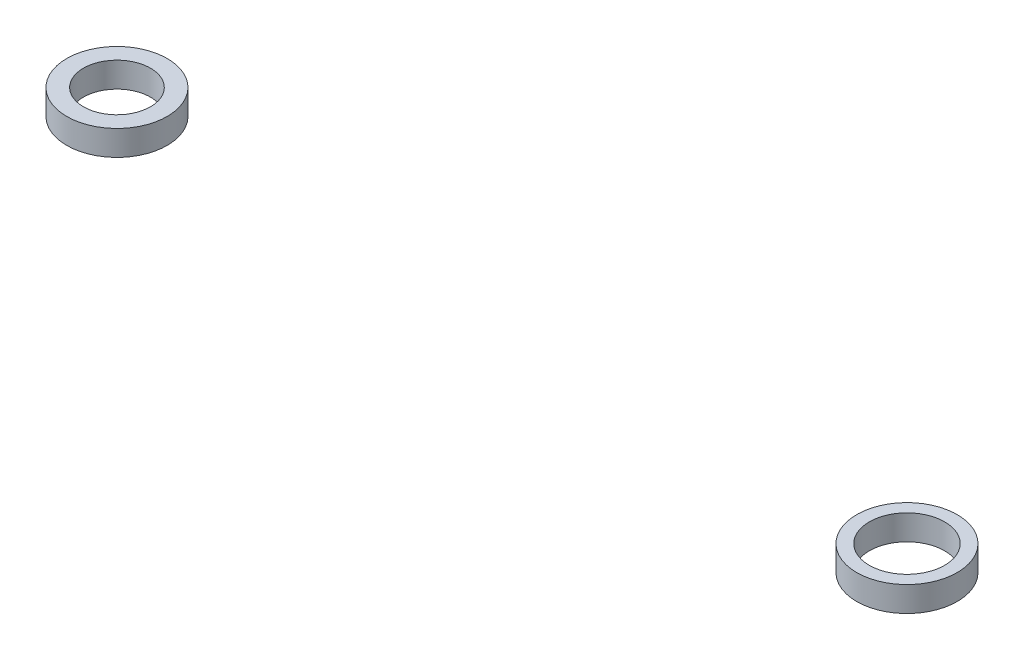
ISO-10303-21;
HEADER;
FILE_DESCRIPTION(('STEP AP214'),'2;1');
FILE_NAME('part.step','',(''),(''),'','','');
FILE_SCHEMA(('AUTOMOTIVE_DESIGN { 1 0 10303 214 1 1 1 1 }'));
ENDSEC;
DATA;
#1=APPLICATION_CONTEXT('core data for automotive mechanical design processes');
#2=APPLICATION_PROTOCOL_DEFINITION('international standard','automotive_design',2000,#1);
#3=PRODUCT_CONTEXT('',#1,'mechanical');
#4=PRODUCT('Part','Part','',(#3));
#5=PRODUCT_RELATED_PRODUCT_CATEGORY('part','',(#4));
#6=PRODUCT_DEFINITION_FORMATION('','',#4);
#7=PRODUCT_DEFINITION_CONTEXT('part definition',#1,'design');
#8=PRODUCT_DEFINITION('design','',#6,#7);
#9=PRODUCT_DEFINITION_SHAPE('','',#8);
#10=(LENGTH_UNIT() NAMED_UNIT(*) SI_UNIT(.MILLI.,.METRE.));
#11=(NAMED_UNIT(*) PLANE_ANGLE_UNIT() SI_UNIT($,.RADIAN.));
#12=(NAMED_UNIT(*) SI_UNIT($,.STERADIAN.) SOLID_ANGLE_UNIT());
#13=UNCERTAINTY_MEASURE_WITH_UNIT(LENGTH_MEASURE(1.E-05),#10,'distance_accuracy_value','');
#14=(GEOMETRIC_REPRESENTATION_CONTEXT(3) GLOBAL_UNCERTAINTY_ASSIGNED_CONTEXT((#13)) GLOBAL_UNIT_ASSIGNED_CONTEXT((#10,
#11,#12)) REPRESENTATION_CONTEXT('',''));
#15=CARTESIAN_POINT('',(0.,0.,0.));
#16=DIRECTION('',(0.,0.,1.));
#17=DIRECTION('',(1.,0.,0.));
#18=AXIS2_PLACEMENT_3D('',#15,#16,#17);
#19=CARTESIAN_POINT('',(94.3699605686569,3.,0.));
#20=DIRECTION('',(0.,1.,0.));
#21=DIRECTION('',(0.,0.,1.));
#22=AXIS2_PLACEMENT_3D('',#19,#20,#21);
#23=PLANE('',#22);
#24=CARTESIAN_POINT('',(94.3699605686569,3.,0.));
#25=DIRECTION('',(0.,1.,0.));
#26=DIRECTION('',(0.,0.,1.));
#27=AXIS2_PLACEMENT_3D('',#24,#25,#26);
#28=CIRCLE('',#27,6.);
#29=CARTESIAN_POINT('',(94.3699605686569,3.,6.));
#30=VERTEX_POINT('',#29);
#31=EDGE_CURVE('E64',#30,#30,#28,.T.);
#32=ORIENTED_EDGE('',*,*,#31,.T.);
#33=EDGE_LOOP('',(#32));
#34=FACE_BOUND('',#33,.T.);
#35=CARTESIAN_POINT('',(94.3699605686569,3.,0.));
#36=DIRECTION('',(0.,1.,0.));
#37=DIRECTION('',(0.,0.,1.));
#38=AXIS2_PLACEMENT_3D('',#35,#36,#37);
#39=CIRCLE('',#38,4.5);
#40=CARTESIAN_POINT('',(94.3699605686569,3.,4.5));
#41=VERTEX_POINT('',#40);
#42=EDGE_CURVE('E55',#41,#41,#39,.T.);
#43=ORIENTED_EDGE('',*,*,#42,.F.);
#44=EDGE_LOOP('',(#43));
#45=FACE_BOUND('',#44,.T.);
#46=ADVANCED_FACE('F51',(#34,#45),#23,.T.);
#47=CARTESIAN_POINT('',(94.3699605686569,0.,0.));
#48=DIRECTION('',(0.,1.,0.));
#49=DIRECTION('',(0.,0.,1.));
#50=AXIS2_PLACEMENT_3D('',#47,#48,#49);
#51=PLANE('',#50);
#52=CARTESIAN_POINT('',(94.3699605686569,0.,0.));
#53=DIRECTION('',(0.,1.,0.));
#54=DIRECTION('',(0.,0.,1.));
#55=AXIS2_PLACEMENT_3D('',#52,#53,#54);
#56=CIRCLE('',#55,6.);
#57=CARTESIAN_POINT('',(94.3699605686569,0.,6.));
#58=VERTEX_POINT('',#57);
#59=EDGE_CURVE('E62',#58,#58,#56,.T.);
#60=ORIENTED_EDGE('',*,*,#59,.F.);
#61=EDGE_LOOP('',(#60));
#62=FACE_BOUND('',#61,.T.);
#63=CARTESIAN_POINT('',(94.3699605686569,0.,0.));
#64=DIRECTION('',(0.,1.,0.));
#65=DIRECTION('',(0.,0.,1.));
#66=AXIS2_PLACEMENT_3D('',#63,#64,#65);
#67=CIRCLE('',#66,4.5);
#68=CARTESIAN_POINT('',(94.3699605686569,0.,4.5));
#69=VERTEX_POINT('',#68);
#70=EDGE_CURVE('E11',#69,#69,#67,.T.);
#71=ORIENTED_EDGE('',*,*,#70,.T.);
#72=EDGE_LOOP('',(#71));
#73=FACE_BOUND('',#72,.T.);
#74=ADVANCED_FACE('F72',(#62,#73),#51,.F.);
#75=CARTESIAN_POINT('',(94.3699605686569,3.,0.));
#76=DIRECTION('',(0.,-1.,0.));
#77=DIRECTION('',(0.,0.,-1.));
#78=AXIS2_PLACEMENT_3D('',#75,#76,#77);
#79=CYLINDRICAL_SURFACE('',#78,6.);
#80=ORIENTED_EDGE('',*,*,#31,.F.);
#81=EDGE_LOOP('',(#80));
#82=FACE_BOUND('',#81,.T.);
#83=ORIENTED_EDGE('',*,*,#59,.T.);
#84=EDGE_LOOP('',(#83));
#85=FACE_BOUND('',#84,.T.);
#86=ADVANCED_FACE('F70',(#82,#85),#79,.T.);
#87=CARTESIAN_POINT('',(94.3699605686569,3.,0.));
#88=DIRECTION('',(0.,-1.,0.));
#89=DIRECTION('',(0.,0.,-1.));
#90=AXIS2_PLACEMENT_3D('',#87,#88,#89);
#91=CYLINDRICAL_SURFACE('',#90,4.5);
#92=ORIENTED_EDGE('',*,*,#42,.T.);
#93=EDGE_LOOP('',(#92));
#94=FACE_BOUND('',#93,.T.);
#95=ORIENTED_EDGE('',*,*,#70,.F.);
#96=EDGE_LOOP('',(#95));
#97=FACE_BOUND('',#96,.T.);
#98=ADVANCED_FACE('F53',(#94,#97),#91,.F.);
#99=CLOSED_SHELL('',(#46,#74,#86,#98));
#100=MANIFOLD_SOLID_BREP('B2',#99);
#101=CARTESIAN_POINT('',(0.,3.,0.));
#102=DIRECTION('',(0.,1.,0.));
#103=DIRECTION('',(0.,0.,1.));
#104=AXIS2_PLACEMENT_3D('',#101,#102,#103);
#105=PLANE('',#104);
#106=CARTESIAN_POINT('',(0.,3.,0.));
#107=DIRECTION('',(0.,1.,0.));
#108=DIRECTION('',(0.,0.,1.));
#109=AXIS2_PLACEMENT_3D('',#106,#107,#108);
#110=CIRCLE('',#109,6.);
#111=CARTESIAN_POINT('',(0.,3.,6.));
#112=VERTEX_POINT('',#111);
#113=EDGE_CURVE('E50',#112,#112,#110,.T.);
#114=ORIENTED_EDGE('',*,*,#113,.T.);
#115=EDGE_LOOP('',(#114));
#116=FACE_BOUND('',#115,.T.);
#117=CARTESIAN_POINT('',(0.,3.,0.));
#118=DIRECTION('',(0.,1.,0.));
#119=DIRECTION('',(0.,0.,1.));
#120=AXIS2_PLACEMENT_3D('',#117,#118,#119);
#121=CIRCLE('',#120,4.);
#122=CARTESIAN_POINT('',(0.,3.,4.));
#123=VERTEX_POINT('',#122);
#124=EDGE_CURVE('E126',#123,#123,#121,.T.);
#125=ORIENTED_EDGE('',*,*,#124,.F.);
#126=EDGE_LOOP('',(#125));
#127=FACE_BOUND('',#126,.T.);
#128=ADVANCED_FACE('F113',(#116,#127),#105,.T.);
#129=CARTESIAN_POINT('',(0.,0.,0.));
#130=DIRECTION('',(0.,1.,0.));
#131=DIRECTION('',(0.,0.,1.));
#132=AXIS2_PLACEMENT_3D('',#129,#130,#131);
#133=PLANE('',#132);
#134=CARTESIAN_POINT('',(0.,0.,0.));
#135=DIRECTION('',(0.,1.,0.));
#136=DIRECTION('',(0.,0.,1.));
#137=AXIS2_PLACEMENT_3D('',#134,#135,#136);
#138=CIRCLE('',#137,6.);
#139=CARTESIAN_POINT('',(0.,0.,6.));
#140=VERTEX_POINT('',#139);
#141=EDGE_CURVE('E117',#140,#140,#138,.T.);
#142=ORIENTED_EDGE('',*,*,#141,.F.);
#143=EDGE_LOOP('',(#142));
#144=FACE_BOUND('',#143,.T.);
#145=CARTESIAN_POINT('',(0.,0.,0.));
#146=DIRECTION('',(0.,1.,0.));
#147=DIRECTION('',(0.,0.,1.));
#148=AXIS2_PLACEMENT_3D('',#145,#146,#147);
#149=CIRCLE('',#148,4.);
#150=CARTESIAN_POINT('',(0.,0.,4.));
#151=VERTEX_POINT('',#150);
#152=EDGE_CURVE('E128',#151,#151,#149,.T.);
#153=ORIENTED_EDGE('',*,*,#152,.T.);
#154=EDGE_LOOP('',(#153));
#155=FACE_BOUND('',#154,.T.);
#156=ADVANCED_FACE('F140',(#144,#155),#133,.F.);
#157=CARTESIAN_POINT('',(0.,3.,0.));
#158=DIRECTION('',(0.,-1.,0.));
#159=DIRECTION('',(0.,0.,-1.));
#160=AXIS2_PLACEMENT_3D('',#157,#158,#159);
#161=CYLINDRICAL_SURFACE('',#160,6.);
#162=ORIENTED_EDGE('',*,*,#113,.F.);
#163=EDGE_LOOP('',(#162));
#164=FACE_BOUND('',#163,.T.);
#165=ORIENTED_EDGE('',*,*,#141,.T.);
#166=EDGE_LOOP('',(#165));
#167=FACE_BOUND('',#166,.T.);
#168=ADVANCED_FACE('F115',(#164,#167),#161,.T.);
#169=CARTESIAN_POINT('',(0.,3.,0.));
#170=DIRECTION('',(0.,-1.,0.));
#171=DIRECTION('',(0.,0.,-1.));
#172=AXIS2_PLACEMENT_3D('',#169,#170,#171);
#173=CYLINDRICAL_SURFACE('',#172,4.);
#174=ORIENTED_EDGE('',*,*,#124,.T.);
#175=EDGE_LOOP('',(#174));
#176=FACE_BOUND('',#175,.T.);
#177=ORIENTED_EDGE('',*,*,#152,.F.);
#178=EDGE_LOOP('',(#177));
#179=FACE_BOUND('',#178,.T.);
#180=ADVANCED_FACE('F136',(#176,#179),#173,.F.);
#181=CLOSED_SHELL('',(#128,#156,#168,#180));
#182=MANIFOLD_SOLID_BREP('B6',#181);
#183=ADVANCED_BREP_SHAPE_REPRESENTATION('',(#18,#100,#182),#14);
#184=SHAPE_DEFINITION_REPRESENTATION(#9,#183);
ENDSEC;
END-ISO-10303-21;
